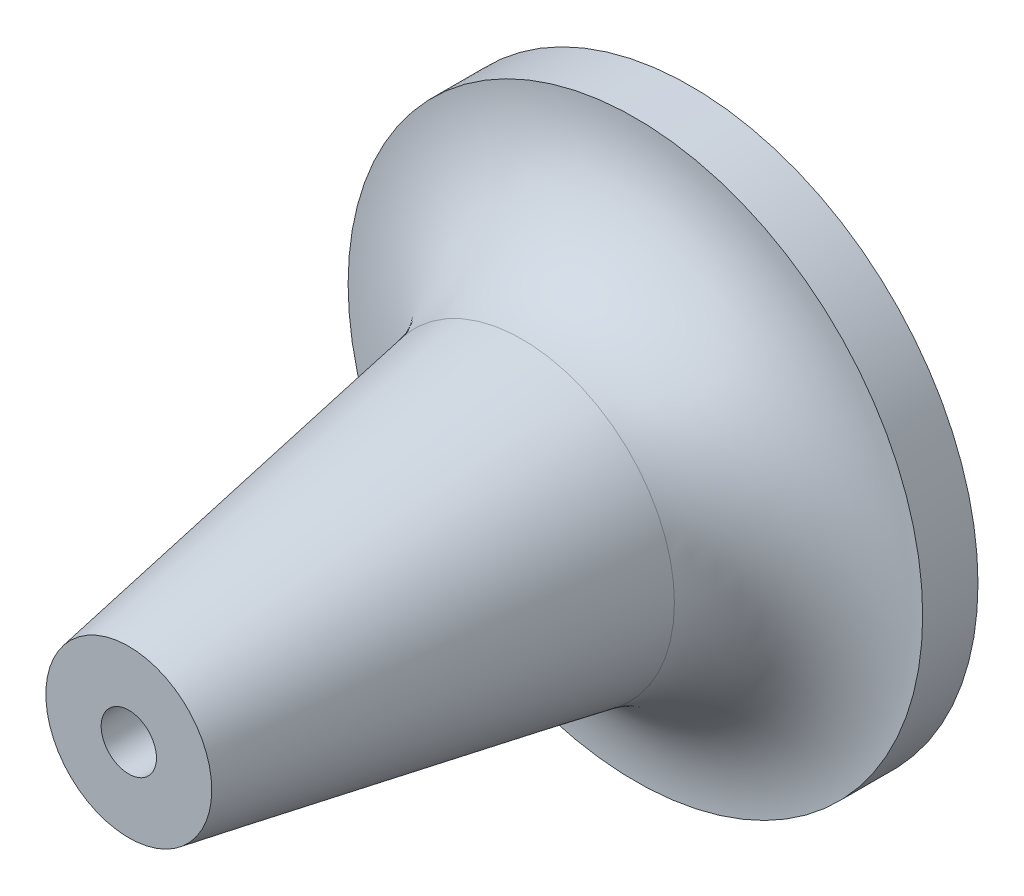
ISO-10303-21;
HEADER;
FILE_DESCRIPTION(('STEP AP214'),'2;1');
FILE_NAME('part.step','',(''),(''),'','','');
FILE_SCHEMA(('AUTOMOTIVE_DESIGN { 1 0 10303 214 1 1 1 1 }'));
ENDSEC;
DATA;
#1=APPLICATION_CONTEXT('core data for automotive mechanical design processes');
#2=APPLICATION_PROTOCOL_DEFINITION('international standard','automotive_design',2000,#1);
#3=PRODUCT_CONTEXT('',#1,'mechanical');
#4=PRODUCT('Part','Part','',(#3));
#5=PRODUCT_RELATED_PRODUCT_CATEGORY('part','',(#4));
#6=PRODUCT_DEFINITION_FORMATION('','',#4);
#7=PRODUCT_DEFINITION_CONTEXT('part definition',#1,'design');
#8=PRODUCT_DEFINITION('design','',#6,#7);
#9=PRODUCT_DEFINITION_SHAPE('','',#8);
#10=(LENGTH_UNIT() NAMED_UNIT(*) SI_UNIT(.MILLI.,.METRE.));
#11=(NAMED_UNIT(*) PLANE_ANGLE_UNIT() SI_UNIT($,.RADIAN.));
#12=(NAMED_UNIT(*) SI_UNIT($,.STERADIAN.) SOLID_ANGLE_UNIT());
#13=UNCERTAINTY_MEASURE_WITH_UNIT(LENGTH_MEASURE(1.E-05),#10,'distance_accuracy_value','');
#14=(GEOMETRIC_REPRESENTATION_CONTEXT(3) GLOBAL_UNCERTAINTY_ASSIGNED_CONTEXT((#13)) GLOBAL_UNIT_ASSIGNED_CONTEXT((#10,
#11,#12)) REPRESENTATION_CONTEXT('',''));
#15=CARTESIAN_POINT('',(0.,0.,0.));
#16=DIRECTION('',(0.,0.,1.));
#17=DIRECTION('',(1.,0.,0.));
#18=AXIS2_PLACEMENT_3D('',#15,#16,#17);
#19=CARTESIAN_POINT('',(0.,7.5,31.3631436956268));
#20=DIRECTION('',(0.,0.,-1.));
#21=DIRECTION('',(-1.,0.,0.));
#22=AXIS2_PLACEMENT_3D('',#19,#20,#21);
#23=PLANE('',#22);
#24=CARTESIAN_POINT('',(0.,0.,31.3631436956268));
#25=DIRECTION('',(0.,0.,1.));
#26=DIRECTION('',(1.,0.,0.));
#27=AXIS2_PLACEMENT_3D('',#24,#25,#26);
#28=CIRCLE('',#27,2.5);
#29=CARTESIAN_POINT('',(2.5,0.,31.3631436956268));
#30=VERTEX_POINT('',#29);
#31=EDGE_CURVE('E10',#30,#30,#28,.T.);
#32=ORIENTED_EDGE('',*,*,#31,.F.);
#33=EDGE_LOOP('',(#32));
#34=FACE_BOUND('',#33,.T.);
#35=CARTESIAN_POINT('',(0.,0.,31.3631436956268));
#36=DIRECTION('',(0.,0.,1.));
#37=DIRECTION('',(1.,0.,0.));
#38=AXIS2_PLACEMENT_3D('',#35,#36,#37);
#39=CIRCLE('',#38,7.5);
#40=CARTESIAN_POINT('',(7.5,0.,31.3631436956268));
#41=VERTEX_POINT('',#40);
#42=EDGE_CURVE('E53',#41,#41,#39,.T.);
#43=ORIENTED_EDGE('',*,*,#42,.T.);
#44=EDGE_LOOP('',(#43));
#45=FACE_BOUND('',#44,.T.);
#46=ADVANCED_FACE('F31',(#34,#45),#23,.F.);
#47=CARTESIAN_POINT('',(0.,0.,51.4954979569622));
#48=DIRECTION('',(0.,0.,1.));
#49=DIRECTION('',(1.,0.,0.));
#50=AXIS2_PLACEMENT_3D('',#47,#48,#49);
#51=CYLINDRICAL_SURFACE('',#50,2.5);
#52=CARTESIAN_POINT('',(0.,0.,-19.4368563043732));
#53=DIRECTION('',(0.,0.,1.));
#54=DIRECTION('',(1.,0.,0.));
#55=AXIS2_PLACEMENT_3D('',#52,#53,#54);
#56=CIRCLE('',#55,2.5);
#57=CARTESIAN_POINT('',(2.5,0.,-19.4368563043732));
#58=VERTEX_POINT('',#57);
#59=EDGE_CURVE('E37',#58,#58,#56,.T.);
#60=ORIENTED_EDGE('',*,*,#59,.F.);
#61=EDGE_LOOP('',(#60));
#62=FACE_BOUND('',#61,.T.);
#63=ORIENTED_EDGE('',*,*,#31,.T.);
#64=EDGE_LOOP('',(#63));
#65=FACE_BOUND('',#64,.T.);
#66=ADVANCED_FACE('F78',(#62,#65),#51,.F.);
#67=CARTESIAN_POINT('',(0.,25.9737442221578,-19.4368563043732));
#68=DIRECTION('',(0.,0.,1.));
#69=DIRECTION('',(1.,0.,0.));
#70=AXIS2_PLACEMENT_3D('',#67,#68,#69);
#71=PLANE('',#70);
#72=CARTESIAN_POINT('',(0.,0.,-19.4368563043732));
#73=DIRECTION('',(0.,0.,1.));
#74=DIRECTION('',(1.,0.,0.));
#75=AXIS2_PLACEMENT_3D('',#72,#73,#74);
#76=CIRCLE('',#75,25.9737442221578);
#77=CARTESIAN_POINT('',(25.9737442221578,0.,-19.4368563043732));
#78=VERTEX_POINT('',#77);
#79=EDGE_CURVE('E41',#78,#78,#76,.T.);
#80=ORIENTED_EDGE('',*,*,#79,.F.);
#81=EDGE_LOOP('',(#80));
#82=FACE_BOUND('',#81,.T.);
#83=ORIENTED_EDGE('',*,*,#59,.T.);
#84=EDGE_LOOP('',(#83));
#85=FACE_BOUND('',#84,.T.);
#86=ADVANCED_FACE('F73',(#82,#85),#71,.F.);
#87=CARTESIAN_POINT('',(0.,0.,51.4954979569622));
#88=DIRECTION('',(0.,0.,1.));
#89=DIRECTION('',(1.,0.,0.));
#90=AXIS2_PLACEMENT_3D('',#87,#88,#89);
#91=CYLINDRICAL_SURFACE('',#90,25.9737442221578);
#92=CARTESIAN_POINT('',(0.,0.,-14.4368563043732));
#93=DIRECTION('',(0.,0.,1.));
#94=DIRECTION('',(1.,0.,0.));
#95=AXIS2_PLACEMENT_3D('',#92,#93,#94);
#96=CIRCLE('',#95,25.9737442221578);
#97=CARTESIAN_POINT('',(25.9737442221578,0.,-14.4368563043732));
#98=VERTEX_POINT('',#97);
#99=EDGE_CURVE('E45',#98,#98,#96,.T.);
#100=ORIENTED_EDGE('',*,*,#99,.F.);
#101=EDGE_LOOP('',(#100));
#102=FACE_BOUND('',#101,.T.);
#103=ORIENTED_EDGE('',*,*,#79,.T.);
#104=EDGE_LOOP('',(#103));
#105=FACE_BOUND('',#104,.T.);
#106=ADVANCED_FACE('F67',(#102,#105),#91,.T.);
#107=CARTESIAN_POINT('',(0.,0.,-2.0450399820118));
#108=DIRECTION('',(0.,0.,1.));
#109=DIRECTION('',(1.,0.,0.));
#110=AXIS2_PLACEMENT_3D('',#107,#108,#109);
#111=TOROIDAL_SURFACE('',#110,25.9737442221578,12.3918163223614);
#112=CARTESIAN_POINT('',(0.,0.,-4.19685630437318));
#113=DIRECTION('',(0.,0.,1.));
#114=DIRECTION('',(1.,0.,0.));
#115=AXIS2_PLACEMENT_3D('',#112,#113,#114);
#116=CIRCLE('',#115,13.770187433993);
#117=CARTESIAN_POINT('',(13.770187433993,0.,-4.19685630437318));
#118=VERTEX_POINT('',#117);
#119=EDGE_CURVE('E50',#118,#118,#116,.T.);
#120=ORIENTED_EDGE('',*,*,#119,.F.);
#121=EDGE_LOOP('',(#120));
#122=FACE_BOUND('',#121,.T.);
#123=ORIENTED_EDGE('',*,*,#99,.T.);
#124=EDGE_LOOP('',(#123));
#125=FACE_BOUND('',#124,.T.);
#126=ADVANCED_FACE('F61',(#122,#125),#111,.F.);
#127=CARTESIAN_POINT('',(0.,0.,-4.19685630437318));
#128=DIRECTION('',(0.,0.,-1.));
#129=DIRECTION('',(-1.,0.,0.));
#130=AXIS2_PLACEMENT_3D('',#127,#128,#129);
#131=CONICAL_SURFACE('',#130,13.770187433993,0.174532925199434);
#132=ORIENTED_EDGE('',*,*,#42,.F.);
#133=EDGE_LOOP('',(#132));
#134=FACE_BOUND('',#133,.T.);
#135=ORIENTED_EDGE('',*,*,#119,.T.);
#136=EDGE_LOOP('',(#135));
#137=FACE_BOUND('',#136,.T.);
#138=ADVANCED_FACE('F58',(#134,#137),#131,.T.);
#139=CLOSED_SHELL('',(#46,#66,#86,#106,#126,#138));
#140=MANIFOLD_SOLID_BREP('B2',#139);
#141=ADVANCED_BREP_SHAPE_REPRESENTATION('',(#18,#140),#14);
#142=SHAPE_DEFINITION_REPRESENTATION(#9,#141);
ENDSEC;
END-ISO-10303-21;
